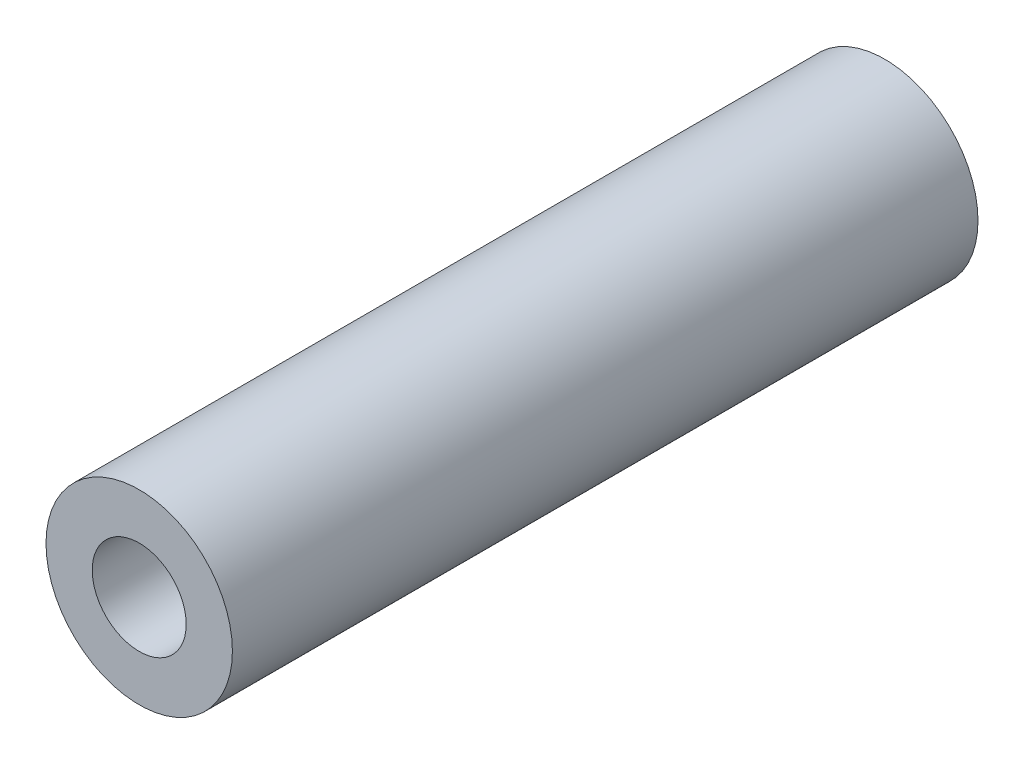
ISO-10303-21;
HEADER;
FILE_DESCRIPTION(('STEP AP214'),'2;1');
FILE_NAME('part.step','',(''),(''),'','','');
FILE_SCHEMA(('AUTOMOTIVE_DESIGN { 1 0 10303 214 1 1 1 1 }'));
ENDSEC;
DATA;
#1=APPLICATION_CONTEXT('core data for automotive mechanical design processes');
#2=APPLICATION_PROTOCOL_DEFINITION('international standard','automotive_design',2000,#1);
#3=PRODUCT_CONTEXT('',#1,'mechanical');
#4=PRODUCT('Part','Part','',(#3));
#5=PRODUCT_RELATED_PRODUCT_CATEGORY('part','',(#4));
#6=PRODUCT_DEFINITION_FORMATION('','',#4);
#7=PRODUCT_DEFINITION_CONTEXT('part definition',#1,'design');
#8=PRODUCT_DEFINITION('design','',#6,#7);
#9=PRODUCT_DEFINITION_SHAPE('','',#8);
#10=(LENGTH_UNIT() NAMED_UNIT(*) SI_UNIT(.MILLI.,.METRE.));
#11=(NAMED_UNIT(*) PLANE_ANGLE_UNIT() SI_UNIT($,.RADIAN.));
#12=(NAMED_UNIT(*) SI_UNIT($,.STERADIAN.) SOLID_ANGLE_UNIT());
#13=UNCERTAINTY_MEASURE_WITH_UNIT(LENGTH_MEASURE(1.E-05),#10,'distance_accuracy_value','');
#14=(GEOMETRIC_REPRESENTATION_CONTEXT(3) GLOBAL_UNCERTAINTY_ASSIGNED_CONTEXT((#13)) GLOBAL_UNIT_ASSIGNED_CONTEXT((#10,
#11,#12)) REPRESENTATION_CONTEXT('',''));
#15=CARTESIAN_POINT('',(0.,0.,0.));
#16=DIRECTION('',(0.,0.,1.));
#17=DIRECTION('',(1.,0.,0.));
#18=AXIS2_PLACEMENT_3D('',#15,#16,#17);
#19=CARTESIAN_POINT('',(0.,0.,25.4));
#20=DIRECTION('',(0.,0.,1.));
#21=DIRECTION('',(1.,0.,0.));
#22=AXIS2_PLACEMENT_3D('',#19,#20,#21);
#23=PLANE('',#22);
#24=CARTESIAN_POINT('',(0.,0.,25.4));
#25=DIRECTION('',(0.,0.,1.));
#26=DIRECTION('',(1.,0.,0.));
#27=AXIS2_PLACEMENT_3D('',#24,#25,#26);
#28=CIRCLE('',#27,6.35);
#29=CARTESIAN_POINT('',(6.35,0.,25.4));
#30=VERTEX_POINT('',#29);
#31=EDGE_CURVE('E10',#30,#30,#28,.T.);
#32=ORIENTED_EDGE('',*,*,#31,.T.);
#33=EDGE_LOOP('',(#32));
#34=FACE_BOUND('',#33,.T.);
#35=CARTESIAN_POINT('',(0.,0.,25.4));
#36=DIRECTION('',(0.,0.,1.));
#37=DIRECTION('',(1.,0.,0.));
#38=AXIS2_PLACEMENT_3D('',#35,#36,#37);
#39=CIRCLE('',#38,3.2004);
#40=CARTESIAN_POINT('',(3.2004,0.,25.4));
#41=VERTEX_POINT('',#40);
#42=EDGE_CURVE('E41',#41,#41,#39,.T.);
#43=ORIENTED_EDGE('',*,*,#42,.F.);
#44=EDGE_LOOP('',(#43));
#45=FACE_BOUND('',#44,.T.);
#46=ADVANCED_FACE('F30',(#34,#45),#23,.T.);
#47=CARTESIAN_POINT('',(0.,0.,-25.4));
#48=DIRECTION('',(0.,0.,1.));
#49=DIRECTION('',(1.,0.,0.));
#50=AXIS2_PLACEMENT_3D('',#47,#48,#49);
#51=PLANE('',#50);
#52=CARTESIAN_POINT('',(0.,0.,-25.4));
#53=DIRECTION('',(0.,0.,1.));
#54=DIRECTION('',(1.,0.,0.));
#55=AXIS2_PLACEMENT_3D('',#52,#53,#54);
#56=CIRCLE('',#55,6.35);
#57=CARTESIAN_POINT('',(6.35,0.,-25.4));
#58=VERTEX_POINT('',#57);
#59=EDGE_CURVE('E34',#58,#58,#56,.T.);
#60=ORIENTED_EDGE('',*,*,#59,.F.);
#61=EDGE_LOOP('',(#60));
#62=FACE_BOUND('',#61,.T.);
#63=CARTESIAN_POINT('',(0.,0.,-25.4));
#64=DIRECTION('',(0.,0.,1.));
#65=DIRECTION('',(1.,0.,0.));
#66=AXIS2_PLACEMENT_3D('',#63,#64,#65);
#67=CIRCLE('',#66,3.2004);
#68=CARTESIAN_POINT('',(3.2004,0.,-25.4));
#69=VERTEX_POINT('',#68);
#70=EDGE_CURVE('E43',#69,#69,#67,.T.);
#71=ORIENTED_EDGE('',*,*,#70,.T.);
#72=EDGE_LOOP('',(#71));
#73=FACE_BOUND('',#72,.T.);
#74=ADVANCED_FACE('F53',(#62,#73),#51,.F.);
#75=CARTESIAN_POINT('',(0.,0.,25.4));
#76=DIRECTION('',(0.,0.,-1.));
#77=DIRECTION('',(-1.,0.,0.));
#78=AXIS2_PLACEMENT_3D('',#75,#76,#77);
#79=CYLINDRICAL_SURFACE('',#78,6.35);
#80=ORIENTED_EDGE('',*,*,#31,.F.);
#81=EDGE_LOOP('',(#80));
#82=FACE_BOUND('',#81,.T.);
#83=ORIENTED_EDGE('',*,*,#59,.T.);
#84=EDGE_LOOP('',(#83));
#85=FACE_BOUND('',#84,.T.);
#86=ADVANCED_FACE('F32',(#82,#85),#79,.T.);
#87=CARTESIAN_POINT('',(0.,0.,25.4));
#88=DIRECTION('',(0.,0.,-1.));
#89=DIRECTION('',(-1.,0.,0.));
#90=AXIS2_PLACEMENT_3D('',#87,#88,#89);
#91=CYLINDRICAL_SURFACE('',#90,3.2004);
#92=ORIENTED_EDGE('',*,*,#42,.T.);
#93=EDGE_LOOP('',(#92));
#94=FACE_BOUND('',#93,.T.);
#95=ORIENTED_EDGE('',*,*,#70,.F.);
#96=EDGE_LOOP('',(#95));
#97=FACE_BOUND('',#96,.T.);
#98=ADVANCED_FACE('F49',(#94,#97),#91,.F.);
#99=CLOSED_SHELL('',(#46,#74,#86,#98));
#100=MANIFOLD_SOLID_BREP('B2',#99);
#101=ADVANCED_BREP_SHAPE_REPRESENTATION('',(#18,#100),#14);
#102=SHAPE_DEFINITION_REPRESENTATION(#9,#101);
ENDSEC;
END-ISO-10303-21;
